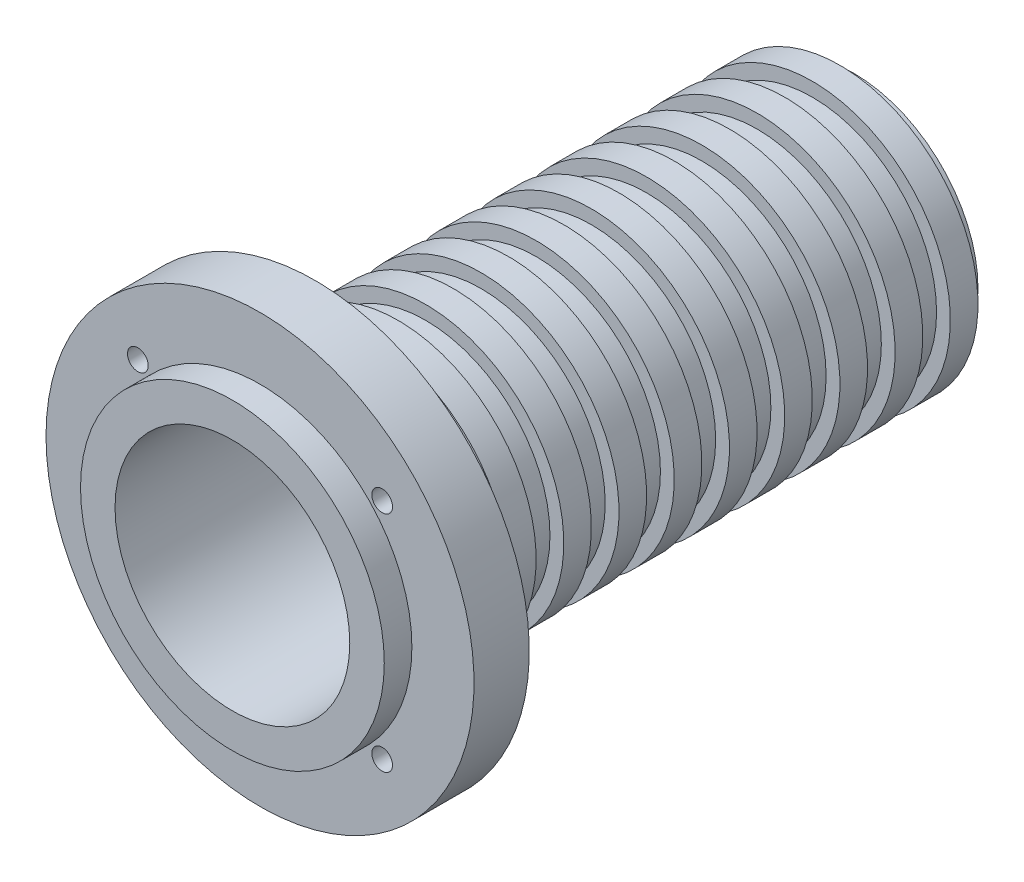
ISO-10303-21;
HEADER;
FILE_DESCRIPTION(('STEP AP214'),'2;1');
FILE_NAME('part.step','',(''),(''),'','','');
FILE_SCHEMA(('AUTOMOTIVE_DESIGN { 1 0 10303 214 1 1 1 1 }'));
ENDSEC;
DATA;
#1=APPLICATION_CONTEXT('core data for automotive mechanical design processes');
#2=APPLICATION_PROTOCOL_DEFINITION('international standard','automotive_design',2000,#1);
#3=PRODUCT_CONTEXT('',#1,'mechanical');
#4=PRODUCT('Part','Part','',(#3));
#5=PRODUCT_RELATED_PRODUCT_CATEGORY('part','',(#4));
#6=PRODUCT_DEFINITION_FORMATION('','',#4);
#7=PRODUCT_DEFINITION_CONTEXT('part definition',#1,'design');
#8=PRODUCT_DEFINITION('design','',#6,#7);
#9=PRODUCT_DEFINITION_SHAPE('','',#8);
#10=(LENGTH_UNIT() NAMED_UNIT(*) SI_UNIT(.MILLI.,.METRE.));
#11=(NAMED_UNIT(*) PLANE_ANGLE_UNIT() SI_UNIT($,.RADIAN.));
#12=(NAMED_UNIT(*) SI_UNIT($,.STERADIAN.) SOLID_ANGLE_UNIT());
#13=UNCERTAINTY_MEASURE_WITH_UNIT(LENGTH_MEASURE(1.E-05),#10,'distance_accuracy_value','');
#14=(GEOMETRIC_REPRESENTATION_CONTEXT(3) GLOBAL_UNCERTAINTY_ASSIGNED_CONTEXT((#13)) GLOBAL_UNIT_ASSIGNED_CONTEXT((#10,
#11,#12)) REPRESENTATION_CONTEXT('',''));
#15=CARTESIAN_POINT('',(0.,0.,0.));
#16=DIRECTION('',(0.,0.,1.));
#17=DIRECTION('',(1.,0.,0.));
#18=AXIS2_PLACEMENT_3D('',#15,#16,#17);
#19=CARTESIAN_POINT('',(0.,0.,-86.));
#20=DIRECTION('',(0.,0.,1.));
#21=DIRECTION('',(1.,0.,0.));
#22=AXIS2_PLACEMENT_3D('',#19,#20,#21);
#23=CYLINDRICAL_SURFACE('',#22,18.);
#24=CARTESIAN_POINT('',(0.,0.,-76.));
#25=DIRECTION('',(0.,0.,-1.));
#26=DIRECTION('',(-1.,0.,0.));
#27=AXIS2_PLACEMENT_3D('',#24,#25,#26);
#28=CIRCLE('',#27,18.);
#29=CARTESIAN_POINT('',(-18.,0.,-76.));
#30=VERTEX_POINT('',#29);
#31=EDGE_CURVE('E194',#30,#30,#28,.F.);
#32=ORIENTED_EDGE('',*,*,#31,.F.);
#33=EDGE_LOOP('',(#32));
#34=FACE_BOUND('',#33,.T.);
#35=CARTESIAN_POINT('',(0.,0.,-80.));
#36=DIRECTION('',(0.,0.,-1.));
#37=DIRECTION('',(-1.,0.,0.));
#38=AXIS2_PLACEMENT_3D('',#35,#36,#37);
#39=CIRCLE('',#38,18.);
#40=CARTESIAN_POINT('',(-18.,0.,-80.));
#41=VERTEX_POINT('',#40);
#42=EDGE_CURVE('E10',#41,#41,#39,.T.);
#43=ORIENTED_EDGE('',*,*,#42,.F.);
#44=EDGE_LOOP('',(#43));
#45=FACE_BOUND('',#44,.T.);
#46=ADVANCED_FACE('F38',(#34,#45),#23,.T.);
#47=CARTESIAN_POINT('',(0.,0.,-68.));
#48=DIRECTION('',(0.,0.,-1.));
#49=DIRECTION('',(-1.,0.,0.));
#50=AXIS2_PLACEMENT_3D('',#47,#48,#49);
#51=CIRCLE('',#50,18.);
#52=CARTESIAN_POINT('',(-18.,0.,-68.));
#53=VERTEX_POINT('',#52);
#54=EDGE_CURVE('E185',#53,#53,#51,.F.);
#55=ORIENTED_EDGE('',*,*,#54,.F.);
#56=EDGE_LOOP('',(#55));
#57=FACE_BOUND('',#56,.T.);
#58=CARTESIAN_POINT('',(0.,0.,-72.));
#59=DIRECTION('',(0.,0.,-1.));
#60=DIRECTION('',(-1.,0.,0.));
#61=AXIS2_PLACEMENT_3D('',#58,#59,#60);
#62=CIRCLE('',#61,18.);
#63=CARTESIAN_POINT('',(-18.,0.,-72.));
#64=VERTEX_POINT('',#63);
#65=EDGE_CURVE('E45',#64,#64,#62,.T.);
#66=ORIENTED_EDGE('',*,*,#65,.F.);
#67=EDGE_LOOP('',(#66));
#68=FACE_BOUND('',#67,.T.);
#69=ADVANCED_FACE('F233',(#57,#68),#23,.T.);
#70=CARTESIAN_POINT('',(0.,0.,-60.));
#71=DIRECTION('',(0.,0.,-1.));
#72=DIRECTION('',(-1.,0.,0.));
#73=AXIS2_PLACEMENT_3D('',#70,#71,#72);
#74=CIRCLE('',#73,18.);
#75=CARTESIAN_POINT('',(-18.,0.,-60.));
#76=VERTEX_POINT('',#75);
#77=EDGE_CURVE('E176',#76,#76,#74,.F.);
#78=ORIENTED_EDGE('',*,*,#77,.F.);
#79=EDGE_LOOP('',(#78));
#80=FACE_BOUND('',#79,.T.);
#81=CARTESIAN_POINT('',(0.,0.,-64.));
#82=DIRECTION('',(0.,0.,-1.));
#83=DIRECTION('',(-1.,0.,0.));
#84=AXIS2_PLACEMENT_3D('',#81,#82,#83);
#85=CIRCLE('',#84,18.);
#86=CARTESIAN_POINT('',(-18.,0.,-64.));
#87=VERTEX_POINT('',#86);
#88=EDGE_CURVE('E49',#87,#87,#85,.T.);
#89=ORIENTED_EDGE('',*,*,#88,.F.);
#90=EDGE_LOOP('',(#89));
#91=FACE_BOUND('',#90,.T.);
#92=ADVANCED_FACE('F238',(#80,#91),#23,.T.);
#93=CARTESIAN_POINT('',(0.,0.,-52.));
#94=DIRECTION('',(0.,0.,-1.));
#95=DIRECTION('',(-1.,0.,0.));
#96=AXIS2_PLACEMENT_3D('',#93,#94,#95);
#97=CIRCLE('',#96,18.);
#98=CARTESIAN_POINT('',(-18.,0.,-52.));
#99=VERTEX_POINT('',#98);
#100=EDGE_CURVE('E167',#99,#99,#97,.F.);
#101=ORIENTED_EDGE('',*,*,#100,.F.);
#102=EDGE_LOOP('',(#101));
#103=FACE_BOUND('',#102,.T.);
#104=CARTESIAN_POINT('',(0.,0.,-56.));
#105=DIRECTION('',(0.,0.,-1.));
#106=DIRECTION('',(-1.,0.,0.));
#107=AXIS2_PLACEMENT_3D('',#104,#105,#106);
#108=CIRCLE('',#107,18.);
#109=CARTESIAN_POINT('',(-18.,0.,-56.));
#110=VERTEX_POINT('',#109);
#111=EDGE_CURVE('E53',#110,#110,#108,.T.);
#112=ORIENTED_EDGE('',*,*,#111,.F.);
#113=EDGE_LOOP('',(#112));
#114=FACE_BOUND('',#113,.T.);
#115=ADVANCED_FACE('F381',(#103,#114),#23,.T.);
#116=CARTESIAN_POINT('',(0.,0.,-44.));
#117=DIRECTION('',(0.,0.,-1.));
#118=DIRECTION('',(-1.,0.,0.));
#119=AXIS2_PLACEMENT_3D('',#116,#117,#118);
#120=CIRCLE('',#119,18.);
#121=CARTESIAN_POINT('',(-18.,0.,-44.));
#122=VERTEX_POINT('',#121);
#123=EDGE_CURVE('E158',#122,#122,#120,.F.);
#124=ORIENTED_EDGE('',*,*,#123,.F.);
#125=EDGE_LOOP('',(#124));
#126=FACE_BOUND('',#125,.T.);
#127=CARTESIAN_POINT('',(0.,0.,-48.));
#128=DIRECTION('',(0.,0.,-1.));
#129=DIRECTION('',(-1.,0.,0.));
#130=AXIS2_PLACEMENT_3D('',#127,#128,#129);
#131=CIRCLE('',#130,18.);
#132=CARTESIAN_POINT('',(-18.,0.,-48.));
#133=VERTEX_POINT('',#132);
#134=EDGE_CURVE('E58',#133,#133,#131,.T.);
#135=ORIENTED_EDGE('',*,*,#134,.F.);
#136=EDGE_LOOP('',(#135));
#137=FACE_BOUND('',#136,.T.);
#138=ADVANCED_FACE('F390',(#126,#137),#23,.T.);
#139=CARTESIAN_POINT('',(0.,0.,-36.));
#140=DIRECTION('',(0.,0.,-1.));
#141=DIRECTION('',(-1.,0.,0.));
#142=AXIS2_PLACEMENT_3D('',#139,#140,#141);
#143=CIRCLE('',#142,18.);
#144=CARTESIAN_POINT('',(-18.,0.,-36.));
#145=VERTEX_POINT('',#144);
#146=EDGE_CURVE('E149',#145,#145,#143,.F.);
#147=ORIENTED_EDGE('',*,*,#146,.F.);
#148=EDGE_LOOP('',(#147));
#149=FACE_BOUND('',#148,.T.);
#150=CARTESIAN_POINT('',(0.,0.,-40.));
#151=DIRECTION('',(0.,0.,-1.));
#152=DIRECTION('',(-1.,0.,0.));
#153=AXIS2_PLACEMENT_3D('',#150,#151,#152);
#154=CIRCLE('',#153,18.);
#155=CARTESIAN_POINT('',(-18.,0.,-40.));
#156=VERTEX_POINT('',#155);
#157=EDGE_CURVE('E61',#156,#156,#154,.T.);
#158=ORIENTED_EDGE('',*,*,#157,.F.);
#159=EDGE_LOOP('',(#158));
#160=FACE_BOUND('',#159,.T.);
#161=ADVANCED_FACE('F399',(#149,#160),#23,.T.);
#162=CARTESIAN_POINT('',(0.,0.,-28.));
#163=DIRECTION('',(0.,0.,-1.));
#164=DIRECTION('',(-1.,0.,0.));
#165=AXIS2_PLACEMENT_3D('',#162,#163,#164);
#166=CIRCLE('',#165,18.);
#167=CARTESIAN_POINT('',(-18.,0.,-28.));
#168=VERTEX_POINT('',#167);
#169=EDGE_CURVE('E140',#168,#168,#166,.F.);
#170=ORIENTED_EDGE('',*,*,#169,.F.);
#171=EDGE_LOOP('',(#170));
#172=FACE_BOUND('',#171,.T.);
#173=CARTESIAN_POINT('',(0.,0.,-32.));
#174=DIRECTION('',(0.,0.,-1.));
#175=DIRECTION('',(-1.,0.,0.));
#176=AXIS2_PLACEMENT_3D('',#173,#174,#175);
#177=CIRCLE('',#176,18.);
#178=CARTESIAN_POINT('',(-18.,0.,-32.));
#179=VERTEX_POINT('',#178);
#180=EDGE_CURVE('E64',#179,#179,#177,.T.);
#181=ORIENTED_EDGE('',*,*,#180,.F.);
#182=EDGE_LOOP('',(#181));
#183=FACE_BOUND('',#182,.T.);
#184=ADVANCED_FACE('F294',(#172,#183),#23,.T.);
#185=CARTESIAN_POINT('',(0.,0.,-20.));
#186=DIRECTION('',(0.,0.,-1.));
#187=DIRECTION('',(-1.,0.,0.));
#188=AXIS2_PLACEMENT_3D('',#185,#186,#187);
#189=CIRCLE('',#188,18.);
#190=CARTESIAN_POINT('',(-18.,0.,-20.));
#191=VERTEX_POINT('',#190);
#192=EDGE_CURVE('E131',#191,#191,#189,.F.);
#193=ORIENTED_EDGE('',*,*,#192,.F.);
#194=EDGE_LOOP('',(#193));
#195=FACE_BOUND('',#194,.T.);
#196=CARTESIAN_POINT('',(0.,0.,-24.));
#197=DIRECTION('',(0.,0.,-1.));
#198=DIRECTION('',(-1.,0.,0.));
#199=AXIS2_PLACEMENT_3D('',#196,#197,#198);
#200=CIRCLE('',#199,18.);
#201=CARTESIAN_POINT('',(-18.,0.,-24.));
#202=VERTEX_POINT('',#201);
#203=EDGE_CURVE('E67',#202,#202,#200,.T.);
#204=ORIENTED_EDGE('',*,*,#203,.F.);
#205=EDGE_LOOP('',(#204));
#206=FACE_BOUND('',#205,.T.);
#207=ADVANCED_FACE('F289',(#195,#206),#23,.T.);
#208=CARTESIAN_POINT('',(0.,0.,-12.));
#209=DIRECTION('',(0.,0.,-1.));
#210=DIRECTION('',(-1.,0.,0.));
#211=AXIS2_PLACEMENT_3D('',#208,#209,#210);
#212=CIRCLE('',#211,18.);
#213=CARTESIAN_POINT('',(-18.,0.,-12.));
#214=VERTEX_POINT('',#213);
#215=EDGE_CURVE('E122',#214,#214,#212,.F.);
#216=ORIENTED_EDGE('',*,*,#215,.F.);
#217=EDGE_LOOP('',(#216));
#218=FACE_BOUND('',#217,.T.);
#219=CARTESIAN_POINT('',(0.,0.,-16.));
#220=DIRECTION('',(0.,0.,-1.));
#221=DIRECTION('',(-1.,0.,0.));
#222=AXIS2_PLACEMENT_3D('',#219,#220,#221);
#223=CIRCLE('',#222,18.);
#224=CARTESIAN_POINT('',(-18.,0.,-16.));
#225=VERTEX_POINT('',#224);
#226=EDGE_CURVE('E70',#225,#225,#223,.T.);
#227=ORIENTED_EDGE('',*,*,#226,.F.);
#228=EDGE_LOOP('',(#227));
#229=FACE_BOUND('',#228,.T.);
#230=ADVANCED_FACE('F218',(#218,#229),#23,.T.);
#231=CARTESIAN_POINT('',(0.,0.,4.));
#232=DIRECTION('',(0.,0.,-1.));
#233=DIRECTION('',(-1.,0.,0.));
#234=AXIS2_PLACEMENT_3D('',#231,#232,#233);
#235=CYLINDRICAL_SURFACE('',#234,22.);
#236=CARTESIAN_POINT('',(0.,0.,4.));
#237=DIRECTION('',(0.,0.,1.));
#238=DIRECTION('',(1.,0.,0.));
#239=AXIS2_PLACEMENT_3D('',#236,#237,#238);
#240=CIRCLE('',#239,22.);
#241=CARTESIAN_POINT('',(22.,0.,4.));
#242=VERTEX_POINT('',#241);
#243=EDGE_CURVE('E73',#242,#242,#240,.T.);
#244=ORIENTED_EDGE('',*,*,#243,.F.);
#245=EDGE_LOOP('',(#244));
#246=FACE_BOUND('',#245,.T.);
#247=CARTESIAN_POINT('',(0.,0.,0.));
#248=DIRECTION('',(0.,0.,1.));
#249=DIRECTION('',(1.,0.,0.));
#250=AXIS2_PLACEMENT_3D('',#247,#248,#249);
#251=CIRCLE('',#250,22.);
#252=CARTESIAN_POINT('',(22.,0.,0.));
#253=VERTEX_POINT('',#252);
#254=EDGE_CURVE('E88',#253,#253,#251,.T.);
#255=ORIENTED_EDGE('',*,*,#254,.T.);
#256=EDGE_LOOP('',(#255));
#257=FACE_BOUND('',#256,.T.);
#258=ADVANCED_FACE('F40',(#246,#257),#235,.T.);
#259=CARTESIAN_POINT('',(0.,0.,4.));
#260=DIRECTION('',(0.,0.,1.));
#261=DIRECTION('',(1.,0.,0.));
#262=AXIS2_PLACEMENT_3D('',#259,#260,#261);
#263=PLANE('',#262);
#264=CARTESIAN_POINT('',(0.,0.,4.));
#265=DIRECTION('',(0.,0.,-1.));
#266=DIRECTION('',(-1.,0.,0.));
#267=AXIS2_PLACEMENT_3D('',#264,#265,#266);
#268=CIRCLE('',#267,17.);
#269=CARTESIAN_POINT('',(-17.,0.,4.));
#270=VERTEX_POINT('',#269);
#271=EDGE_CURVE('E112',#270,#270,#268,.T.);
#272=ORIENTED_EDGE('',*,*,#271,.T.);
#273=EDGE_LOOP('',(#272));
#274=FACE_BOUND('',#273,.T.);
#275=ORIENTED_EDGE('',*,*,#243,.T.);
#276=EDGE_LOOP('',(#275));
#277=FACE_BOUND('',#276,.T.);
#278=ADVANCED_FACE('F268',(#274,#277),#263,.T.);
#279=CARTESIAN_POINT('',(0.,0.,-8.));
#280=DIRECTION('',(0.,0.,1.));
#281=DIRECTION('',(1.,0.,0.));
#282=AXIS2_PLACEMENT_3D('',#279,#280,#281);
#283=CYLINDRICAL_SURFACE('',#282,31.);
#284=CARTESIAN_POINT('',(0.,0.,-8.));
#285=DIRECTION('',(0.,0.,-1.));
#286=DIRECTION('',(-1.,0.,0.));
#287=AXIS2_PLACEMENT_3D('',#284,#285,#286);
#288=CIRCLE('',#287,31.);
#289=CARTESIAN_POINT('',(-31.,0.,-8.));
#290=VERTEX_POINT('',#289);
#291=EDGE_CURVE('E91',#290,#290,#288,.T.);
#292=ORIENTED_EDGE('',*,*,#291,.F.);
#293=EDGE_LOOP('',(#292));
#294=FACE_BOUND('',#293,.T.);
#295=CARTESIAN_POINT('',(0.,0.,0.));
#296=DIRECTION('',(0.,0.,-1.));
#297=DIRECTION('',(-1.,0.,0.));
#298=AXIS2_PLACEMENT_3D('',#295,#296,#297);
#299=CIRCLE('',#298,31.);
#300=CARTESIAN_POINT('',(-31.,0.,0.));
#301=VERTEX_POINT('',#300);
#302=EDGE_CURVE('E77',#301,#301,#299,.T.);
#303=ORIENTED_EDGE('',*,*,#302,.T.);
#304=EDGE_LOOP('',(#303));
#305=FACE_BOUND('',#304,.T.);
#306=ADVANCED_FACE('F262',(#294,#305),#283,.T.);
#307=CARTESIAN_POINT('',(0.,0.,-8.));
#308=DIRECTION('',(0.,0.,-1.));
#309=DIRECTION('',(-1.,0.,0.));
#310=AXIS2_PLACEMENT_3D('',#307,#308,#309);
#311=PLANE('',#310);
#312=CARTESIAN_POINT('',(0.,0.,-8.));
#313=DIRECTION('',(0.,0.,-1.));
#314=DIRECTION('',(-1.,0.,0.));
#315=AXIS2_PLACEMENT_3D('',#312,#313,#314);
#316=CIRCLE('',#315,20.);
#317=CARTESIAN_POINT('',(-20.,0.,-8.));
#318=VERTEX_POINT('',#317);
#319=EDGE_CURVE('E119',#318,#318,#316,.T.);
#320=ORIENTED_EDGE('',*,*,#319,.F.);
#321=EDGE_LOOP('',(#320));
#322=FACE_BOUND('',#321,.T.);
#323=CARTESIAN_POINT('',(-17.695427461586,16.2133231310471,-8.));
#324=DIRECTION('',(0.,0.,-1.));
#325=DIRECTION('',(-1.,0.,0.));
#326=AXIS2_PLACEMENT_3D('',#323,#324,#325);
#327=CIRCLE('',#326,1.5);
#328=CARTESIAN_POINT('',(-19.1954274615861,16.2133231310471,-8.));
#329=VERTEX_POINT('',#328);
#330=EDGE_CURVE('E101',#329,#329,#327,.T.);
#331=ORIENTED_EDGE('',*,*,#330,.F.);
#332=EDGE_LOOP('',(#331));
#333=FACE_BOUND('',#332,.T.);
#334=CARTESIAN_POINT('',(-17.6954274615861,-16.2133231310471,-8.));
#335=DIRECTION('',(0.,0.,-1.));
#336=DIRECTION('',(-1.,0.,0.));
#337=AXIS2_PLACEMENT_3D('',#334,#335,#336);
#338=CIRCLE('',#337,1.5);
#339=CARTESIAN_POINT('',(-19.1954274615861,-16.2133231310471,-8.));
#340=VERTEX_POINT('',#339);
#341=EDGE_CURVE('E104',#340,#340,#338,.T.);
#342=ORIENTED_EDGE('',*,*,#341,.F.);
#343=EDGE_LOOP('',(#342));
#344=FACE_BOUND('',#343,.T.);
#345=CARTESIAN_POINT('',(17.6954274615861,-16.2133231310471,-8.));
#346=DIRECTION('',(0.,0.,-1.));
#347=DIRECTION('',(-1.,0.,0.));
#348=AXIS2_PLACEMENT_3D('',#345,#346,#347);
#349=CIRCLE('',#348,1.5);
#350=CARTESIAN_POINT('',(16.1954274615861,-16.2133231310471,-8.));
#351=VERTEX_POINT('',#350);
#352=EDGE_CURVE('E100',#351,#351,#349,.T.);
#353=ORIENTED_EDGE('',*,*,#352,.F.);
#354=EDGE_LOOP('',(#353));
#355=FACE_BOUND('',#354,.T.);
#356=CARTESIAN_POINT('',(17.6954274615861,16.2133231310471,-8.));
#357=DIRECTION('',(0.,0.,-1.));
#358=DIRECTION('',(-1.,0.,0.));
#359=AXIS2_PLACEMENT_3D('',#356,#357,#358);
#360=CIRCLE('',#359,1.5);
#361=CARTESIAN_POINT('',(16.1954274615861,16.2133231310471,-8.));
#362=VERTEX_POINT('',#361);
#363=EDGE_CURVE('E87',#362,#362,#360,.T.);
#364=ORIENTED_EDGE('',*,*,#363,.F.);
#365=EDGE_LOOP('',(#364));
#366=FACE_BOUND('',#365,.T.);
#367=ORIENTED_EDGE('',*,*,#291,.T.);
#368=EDGE_LOOP('',(#367));
#369=FACE_BOUND('',#368,.T.);
#370=ADVANCED_FACE('F259',(#322,#333,#344,#355,#366,#369),#311,.T.);
#371=CARTESIAN_POINT('',(0.,0.,0.));
#372=DIRECTION('',(0.,0.,-1.));
#373=DIRECTION('',(-1.,0.,0.));
#374=AXIS2_PLACEMENT_3D('',#371,#372,#373);
#375=PLANE('',#374);
#376=CARTESIAN_POINT('',(-17.695427461586,16.2133231310471,0.));
#377=DIRECTION('',(0.,0.,-1.));
#378=DIRECTION('',(-1.,0.,0.));
#379=AXIS2_PLACEMENT_3D('',#376,#377,#378);
#380=CIRCLE('',#379,1.5);
#381=CARTESIAN_POINT('',(-19.1954274615861,16.2133231310471,0.));
#382=VERTEX_POINT('',#381);
#383=EDGE_CURVE('E74',#382,#382,#380,.T.);
#384=ORIENTED_EDGE('',*,*,#383,.T.);
#385=EDGE_LOOP('',(#384));
#386=FACE_BOUND('',#385,.T.);
#387=CARTESIAN_POINT('',(-17.6954274615861,-16.2133231310471,0.));
#388=DIRECTION('',(0.,0.,-1.));
#389=DIRECTION('',(-1.,0.,0.));
#390=AXIS2_PLACEMENT_3D('',#387,#388,#389);
#391=CIRCLE('',#390,1.5);
#392=CARTESIAN_POINT('',(-19.1954274615861,-16.2133231310471,0.));
#393=VERTEX_POINT('',#392);
#394=EDGE_CURVE('E78',#393,#393,#391,.T.);
#395=ORIENTED_EDGE('',*,*,#394,.T.);
#396=EDGE_LOOP('',(#395));
#397=FACE_BOUND('',#396,.T.);
#398=CARTESIAN_POINT('',(17.6954274615861,-16.2133231310471,0.));
#399=DIRECTION('',(0.,0.,-1.));
#400=DIRECTION('',(-1.,0.,0.));
#401=AXIS2_PLACEMENT_3D('',#398,#399,#400);
#402=CIRCLE('',#401,1.5);
#403=CARTESIAN_POINT('',(16.1954274615861,-16.2133231310471,0.));
#404=VERTEX_POINT('',#403);
#405=EDGE_CURVE('E81',#404,#404,#402,.T.);
#406=ORIENTED_EDGE('',*,*,#405,.T.);
#407=EDGE_LOOP('',(#406));
#408=FACE_BOUND('',#407,.T.);
#409=CARTESIAN_POINT('',(17.6954274615861,16.2133231310471,0.));
#410=DIRECTION('',(0.,0.,-1.));
#411=DIRECTION('',(-1.,0.,0.));
#412=AXIS2_PLACEMENT_3D('',#409,#410,#411);
#413=CIRCLE('',#412,1.5);
#414=CARTESIAN_POINT('',(16.1954274615861,16.2133231310471,0.));
#415=VERTEX_POINT('',#414);
#416=EDGE_CURVE('E84',#415,#415,#413,.T.);
#417=ORIENTED_EDGE('',*,*,#416,.T.);
#418=EDGE_LOOP('',(#417));
#419=FACE_BOUND('',#418,.T.);
#420=ORIENTED_EDGE('',*,*,#254,.F.);
#421=EDGE_LOOP('',(#420));
#422=FACE_BOUND('',#421,.T.);
#423=ORIENTED_EDGE('',*,*,#302,.F.);
#424=EDGE_LOOP('',(#423));
#425=FACE_BOUND('',#424,.T.);
#426=ADVANCED_FACE('F257',(#386,#397,#408,#419,#422,#425),#375,.F.);
#427=CARTESIAN_POINT('',(17.6954274615861,16.2133231310471,4.));
#428=DIRECTION('',(0.,0.,-1.));
#429=DIRECTION('',(-1.,0.,0.));
#430=AXIS2_PLACEMENT_3D('',#427,#428,#429);
#431=CYLINDRICAL_SURFACE('',#430,1.5);
#432=ORIENTED_EDGE('',*,*,#363,.T.);
#433=EDGE_LOOP('',(#432));
#434=FACE_BOUND('',#433,.T.);
#435=ORIENTED_EDGE('',*,*,#416,.F.);
#436=EDGE_LOOP('',(#435));
#437=FACE_BOUND('',#436,.T.);
#438=ADVANCED_FACE('F247',(#434,#437),#431,.F.);
#439=CARTESIAN_POINT('',(17.6954274615861,-16.2133231310471,4.));
#440=DIRECTION('',(0.,0.,-1.));
#441=DIRECTION('',(-1.,0.,0.));
#442=AXIS2_PLACEMENT_3D('',#439,#440,#441);
#443=CYLINDRICAL_SURFACE('',#442,1.5);
#444=ORIENTED_EDGE('',*,*,#352,.T.);
#445=EDGE_LOOP('',(#444));
#446=FACE_BOUND('',#445,.T.);
#447=ORIENTED_EDGE('',*,*,#405,.F.);
#448=EDGE_LOOP('',(#447));
#449=FACE_BOUND('',#448,.T.);
#450=ADVANCED_FACE('F243',(#446,#449),#443,.F.);
#451=CARTESIAN_POINT('',(-17.6954274615861,-16.2133231310471,4.));
#452=DIRECTION('',(0.,0.,-1.));
#453=DIRECTION('',(-1.,0.,0.));
#454=AXIS2_PLACEMENT_3D('',#451,#452,#453);
#455=CYLINDRICAL_SURFACE('',#454,1.5);
#456=ORIENTED_EDGE('',*,*,#341,.T.);
#457=EDGE_LOOP('',(#456));
#458=FACE_BOUND('',#457,.T.);
#459=ORIENTED_EDGE('',*,*,#394,.F.);
#460=EDGE_LOOP('',(#459));
#461=FACE_BOUND('',#460,.T.);
#462=ADVANCED_FACE('F246',(#458,#461),#455,.F.);
#463=CARTESIAN_POINT('',(-17.695427461586,16.2133231310471,4.));
#464=DIRECTION('',(0.,0.,-1.));
#465=DIRECTION('',(-1.,0.,0.));
#466=AXIS2_PLACEMENT_3D('',#463,#464,#465);
#467=CYLINDRICAL_SURFACE('',#466,1.5);
#468=ORIENTED_EDGE('',*,*,#330,.T.);
#469=EDGE_LOOP('',(#468));
#470=FACE_BOUND('',#469,.T.);
#471=ORIENTED_EDGE('',*,*,#383,.F.);
#472=EDGE_LOOP('',(#471));
#473=FACE_BOUND('',#472,.T.);
#474=ADVANCED_FACE('F216',(#470,#473),#467,.F.);
#475=CARTESIAN_POINT('',(0.,0.,-84.));
#476=DIRECTION('',(0.,0.,-1.));
#477=DIRECTION('',(-1.,0.,0.));
#478=AXIS2_PLACEMENT_3D('',#475,#476,#477);
#479=CIRCLE('',#478,18.);
#480=CARTESIAN_POINT('',(-18.,0.,-84.));
#481=VERTEX_POINT('',#480);
#482=EDGE_CURVE('E203',#481,#481,#479,.F.);
#483=ORIENTED_EDGE('',*,*,#482,.F.);
#484=EDGE_LOOP('',(#483));
#485=FACE_BOUND('',#484,.T.);
#486=CARTESIAN_POINT('',(0.,0.,-86.));
#487=DIRECTION('',(0.,0.,-1.));
#488=DIRECTION('',(-1.,0.,0.));
#489=AXIS2_PLACEMENT_3D('',#486,#487,#488);
#490=CIRCLE('',#489,18.);
#491=CARTESIAN_POINT('',(-18.,0.,-86.));
#492=VERTEX_POINT('',#491);
#493=EDGE_CURVE('E105',#492,#492,#490,.T.);
#494=ORIENTED_EDGE('',*,*,#493,.F.);
#495=EDGE_LOOP('',(#494));
#496=FACE_BOUND('',#495,.T.);
#497=ADVANCED_FACE('F212',(#485,#496),#23,.T.);
#498=CARTESIAN_POINT('',(0.,0.,-86.));
#499=DIRECTION('',(0.,0.,-1.));
#500=DIRECTION('',(-1.,0.,0.));
#501=AXIS2_PLACEMENT_3D('',#498,#499,#500);
#502=PLANE('',#501);
#503=CARTESIAN_POINT('',(0.,0.,-86.));
#504=DIRECTION('',(0.,0.,-1.));
#505=DIRECTION('',(-1.,0.,0.));
#506=AXIS2_PLACEMENT_3D('',#503,#504,#505);
#507=CIRCLE('',#506,17.);
#508=CARTESIAN_POINT('',(-17.,0.,-86.));
#509=VERTEX_POINT('',#508);
#510=EDGE_CURVE('E113',#509,#509,#507,.T.);
#511=ORIENTED_EDGE('',*,*,#510,.F.);
#512=EDGE_LOOP('',(#511));
#513=FACE_BOUND('',#512,.T.);
#514=ORIENTED_EDGE('',*,*,#493,.T.);
#515=EDGE_LOOP('',(#514));
#516=FACE_BOUND('',#515,.T.);
#517=ADVANCED_FACE('F215',(#513,#516),#502,.T.);
#518=CARTESIAN_POINT('',(0.,0.,4.));
#519=DIRECTION('',(0.,0.,-1.));
#520=DIRECTION('',(-1.,0.,0.));
#521=AXIS2_PLACEMENT_3D('',#518,#519,#520);
#522=CYLINDRICAL_SURFACE('',#521,17.);
#523=CARTESIAN_POINT('',(-17.,0.,4.));
#524=CARTESIAN_POINT('',(-17.,0.,3.06250000000001));
#525=CARTESIAN_POINT('',(-17.,0.,2.125));
#526=CARTESIAN_POINT('',(-17.,0.,0.250000000000004));
#527=CARTESIAN_POINT('',(-17.,0.,-0.687499999999996));
#528=CARTESIAN_POINT('',(-17.,0.,-2.5625));
#529=CARTESIAN_POINT('',(-17.,0.,-3.5));
#530=CARTESIAN_POINT('',(-17.,0.,-5.37499999999999));
#531=CARTESIAN_POINT('',(-17.,0.,-6.3125));
#532=CARTESIAN_POINT('',(-17.,0.,-8.18749999999999));
#533=CARTESIAN_POINT('',(-17.,0.,-9.12499999999999));
#534=CARTESIAN_POINT('',(-17.,0.,-11.));
#535=CARTESIAN_POINT('',(-17.,0.,-11.9375));
#536=CARTESIAN_POINT('',(-17.,0.,-13.8125));
#537=CARTESIAN_POINT('',(-17.,0.,-14.75));
#538=CARTESIAN_POINT('',(-17.,0.,-16.625));
#539=CARTESIAN_POINT('',(-17.,0.,-17.5625));
#540=CARTESIAN_POINT('',(-17.,0.,-19.4375));
#541=CARTESIAN_POINT('',(-17.,0.,-20.375));
#542=CARTESIAN_POINT('',(-17.,0.,-22.25));
#543=CARTESIAN_POINT('',(-17.,0.,-23.1875));
#544=CARTESIAN_POINT('',(-17.,0.,-25.0625));
#545=CARTESIAN_POINT('',(-17.,0.,-26.));
#546=CARTESIAN_POINT('',(-17.,0.,-27.875));
#547=CARTESIAN_POINT('',(-17.,0.,-28.8125));
#548=CARTESIAN_POINT('',(-17.,0.,-30.6875));
#549=CARTESIAN_POINT('',(-17.,0.,-31.625));
#550=CARTESIAN_POINT('',(-17.,0.,-33.5));
#551=CARTESIAN_POINT('',(-17.,0.,-34.4375));
#552=CARTESIAN_POINT('',(-17.,0.,-36.3125));
#553=CARTESIAN_POINT('',(-17.,0.,-37.25));
#554=CARTESIAN_POINT('',(-17.,0.,-39.125));
#555=CARTESIAN_POINT('',(-17.,0.,-40.0625));
#556=CARTESIAN_POINT('',(-17.,0.,-41.9375));
#557=CARTESIAN_POINT('',(-17.,0.,-42.875));
#558=CARTESIAN_POINT('',(-17.,0.,-44.75));
#559=CARTESIAN_POINT('',(-17.,0.,-45.6875));
#560=CARTESIAN_POINT('',(-17.,0.,-47.5625));
#561=CARTESIAN_POINT('',(-17.,0.,-48.5));
#562=CARTESIAN_POINT('',(-17.,0.,-50.375));
#563=CARTESIAN_POINT('',(-17.,0.,-51.3125));
#564=CARTESIAN_POINT('',(-17.,0.,-53.1875));
#565=CARTESIAN_POINT('',(-17.,0.,-54.125));
#566=CARTESIAN_POINT('',(-17.,0.,-56.));
#567=CARTESIAN_POINT('',(-17.,0.,-56.9375));
#568=CARTESIAN_POINT('',(-17.,0.,-58.8125));
#569=CARTESIAN_POINT('',(-17.,0.,-59.75));
#570=CARTESIAN_POINT('',(-17.,0.,-61.625));
#571=CARTESIAN_POINT('',(-17.,0.,-62.5625));
#572=CARTESIAN_POINT('',(-17.,0.,-64.4375));
#573=CARTESIAN_POINT('',(-17.,0.,-65.375));
#574=CARTESIAN_POINT('',(-17.,0.,-67.25));
#575=CARTESIAN_POINT('',(-17.,0.,-68.1875));
#576=CARTESIAN_POINT('',(-17.,0.,-70.0625));
#577=CARTESIAN_POINT('',(-17.,0.,-71.));
#578=CARTESIAN_POINT('',(-17.,0.,-72.875));
#579=CARTESIAN_POINT('',(-17.,0.,-73.8125));
#580=CARTESIAN_POINT('',(-17.,0.,-75.6875));
#581=CARTESIAN_POINT('',(-17.,0.,-76.625));
#582=CARTESIAN_POINT('',(-17.,0.,-78.5));
#583=CARTESIAN_POINT('',(-17.,0.,-79.4375));
#584=CARTESIAN_POINT('',(-17.,0.,-81.3125));
#585=CARTESIAN_POINT('',(-17.,0.,-82.25));
#586=CARTESIAN_POINT('',(-17.,0.,-84.125));
#587=CARTESIAN_POINT('',(-17.,0.,-85.0625));
#588=CARTESIAN_POINT('',(-17.,0.,-86.));
#589=B_SPLINE_CURVE_WITH_KNOTS('',3,(#523,#524,#525,#526,#527,#528,#529,#530,#531,#532,#533,
#534,#535,#536,#537,#538,#539,#540,#541,#542,#543,#544,#545,#546,#547,#548,#549,#550,#551,#552,
#553,#554,#555,#556,#557,#558,#559,#560,#561,#562,#563,#564,#565,#566,#567,#568,#569,#570,#571,
#572,#573,#574,#575,#576,#577,#578,#579,#580,#581,#582,#583,#584,#585,#586,#587,#588),
.UNSPECIFIED.,.F.,.F.,(4,2,2,2,2,2,2,2,2,2,2,2,2,2,2,2,2,2,2,2,2,2,2,2,2,2,2,2,2,2,2,2,4),(0.,
2.8125,5.625,8.4375,11.25,14.0625,16.875,19.6875,22.5,25.3125,28.125,30.9375,33.75,36.5625,
39.375,42.1875,45.,47.8125,50.625,53.4375,56.25,59.0625,61.875,64.6875,67.5,70.3125,73.125,
75.9375,78.75,81.5625,84.375,87.1875,90.),.UNSPECIFIED.);
#590=EDGE_CURVE('BSEAM222',#270,#509,#589,.T.);
#591=ORIENTED_EDGE('',*,*,#271,.F.);
#592=ORIENTED_EDGE('',*,*,#510,.T.);
#593=ORIENTED_EDGE('',*,*,#590,.T.);
#594=ORIENTED_EDGE('',*,*,#590,.F.);
#595=EDGE_LOOP('',(#591,#593,#592,#594));
#596=FACE_BOUND('',#595,.T.);
#597=ADVANCED_FACE('F222',(#596),#522,.F.);
#598=CARTESIAN_POINT('',(0.,0.,-12.));
#599=DIRECTION('',(0.,0.,1.));
#600=DIRECTION('',(1.,0.,0.));
#601=AXIS2_PLACEMENT_3D('',#598,#599,#600);
#602=CYLINDRICAL_SURFACE('',#601,20.);
#603=CARTESIAN_POINT('',(0.,0.,-12.));
#604=DIRECTION('',(0.,0.,-1.));
#605=DIRECTION('',(-1.,0.,0.));
#606=AXIS2_PLACEMENT_3D('',#603,#604,#605);
#607=CIRCLE('',#606,20.);
#608=CARTESIAN_POINT('',(-20.,0.,-12.));
#609=VERTEX_POINT('',#608);
#610=EDGE_CURVE('E116',#609,#609,#607,.T.);
#611=ORIENTED_EDGE('',*,*,#610,.F.);
#612=EDGE_LOOP('',(#611));
#613=FACE_BOUND('',#612,.T.);
#614=ORIENTED_EDGE('',*,*,#319,.T.);
#615=EDGE_LOOP('',(#614));
#616=FACE_BOUND('',#615,.T.);
#617=ADVANCED_FACE('F228',(#613,#616),#602,.T.);
#618=CARTESIAN_POINT('',(0.,0.,-12.));
#619=DIRECTION('',(0.,0.,-1.));
#620=DIRECTION('',(-1.,0.,0.));
#621=AXIS2_PLACEMENT_3D('',#618,#619,#620);
#622=PLANE('',#621);
#623=ORIENTED_EDGE('',*,*,#215,.T.);
#624=EDGE_LOOP('',(#623));
#625=FACE_BOUND('',#624,.T.);
#626=ORIENTED_EDGE('',*,*,#610,.T.);
#627=EDGE_LOOP('',(#626));
#628=FACE_BOUND('',#627,.T.);
#629=ADVANCED_FACE('F310',(#625,#628),#622,.T.);
#630=CARTESIAN_POINT('',(0.,0.,-20.));
#631=DIRECTION('',(0.,0.,1.));
#632=DIRECTION('',(1.,0.,0.));
#633=AXIS2_PLACEMENT_3D('',#630,#631,#632);
#634=CYLINDRICAL_SURFACE('',#633,20.);
#635=CARTESIAN_POINT('',(0.,0.,-20.));
#636=DIRECTION('',(0.,0.,-1.));
#637=DIRECTION('',(-1.,0.,0.));
#638=AXIS2_PLACEMENT_3D('',#635,#636,#637);
#639=CIRCLE('',#638,20.);
#640=CARTESIAN_POINT('',(-20.,0.,-20.));
#641=VERTEX_POINT('',#640);
#642=EDGE_CURVE('E123',#641,#641,#639,.T.);
#643=ORIENTED_EDGE('',*,*,#642,.F.);
#644=EDGE_LOOP('',(#643));
#645=FACE_BOUND('',#644,.T.);
#646=CARTESIAN_POINT('',(0.,0.,-16.));
#647=DIRECTION('',(0.,0.,-1.));
#648=DIRECTION('',(-1.,0.,0.));
#649=AXIS2_PLACEMENT_3D('',#646,#647,#648);
#650=CIRCLE('',#649,20.);
#651=CARTESIAN_POINT('',(-20.,0.,-16.));
#652=VERTEX_POINT('',#651);
#653=EDGE_CURVE('E128',#652,#652,#650,.T.);
#654=ORIENTED_EDGE('',*,*,#653,.T.);
#655=EDGE_LOOP('',(#654));
#656=FACE_BOUND('',#655,.T.);
#657=ADVANCED_FACE('F308',(#645,#656),#634,.T.);
#658=CARTESIAN_POINT('',(0.,0.,-20.));
#659=DIRECTION('',(0.,0.,-1.));
#660=DIRECTION('',(-1.,0.,0.));
#661=AXIS2_PLACEMENT_3D('',#658,#659,#660);
#662=PLANE('',#661);
#663=ORIENTED_EDGE('',*,*,#192,.T.);
#664=EDGE_LOOP('',(#663));
#665=FACE_BOUND('',#664,.T.);
#666=ORIENTED_EDGE('',*,*,#642,.T.);
#667=EDGE_LOOP('',(#666));
#668=FACE_BOUND('',#667,.T.);
#669=ADVANCED_FACE('F304',(#665,#668),#662,.T.);
#670=CARTESIAN_POINT('',(0.,0.,-16.));
#671=DIRECTION('',(0.,0.,-1.));
#672=DIRECTION('',(-1.,0.,0.));
#673=AXIS2_PLACEMENT_3D('',#670,#671,#672);
#674=PLANE('',#673);
#675=ORIENTED_EDGE('',*,*,#226,.T.);
#676=EDGE_LOOP('',(#675));
#677=FACE_BOUND('',#676,.T.);
#678=ORIENTED_EDGE('',*,*,#653,.F.);
#679=EDGE_LOOP('',(#678));
#680=FACE_BOUND('',#679,.T.);
#681=ADVANCED_FACE('F300',(#677,#680),#674,.F.);
#682=CARTESIAN_POINT('',(0.,0.,-28.));
#683=DIRECTION('',(0.,0.,1.));
#684=DIRECTION('',(1.,0.,0.));
#685=AXIS2_PLACEMENT_3D('',#682,#683,#684);
#686=CYLINDRICAL_SURFACE('',#685,20.);
#687=CARTESIAN_POINT('',(0.,0.,-28.));
#688=DIRECTION('',(0.,0.,-1.));
#689=DIRECTION('',(-1.,0.,0.));
#690=AXIS2_PLACEMENT_3D('',#687,#688,#689);
#691=CIRCLE('',#690,20.);
#692=CARTESIAN_POINT('',(-20.,0.,-28.));
#693=VERTEX_POINT('',#692);
#694=EDGE_CURVE('E132',#693,#693,#691,.T.);
#695=ORIENTED_EDGE('',*,*,#694,.F.);
#696=EDGE_LOOP('',(#695));
#697=FACE_BOUND('',#696,.T.);
#698=CARTESIAN_POINT('',(0.,0.,-24.));
#699=DIRECTION('',(0.,0.,-1.));
#700=DIRECTION('',(-1.,0.,0.));
#701=AXIS2_PLACEMENT_3D('',#698,#699,#700);
#702=CIRCLE('',#701,20.);
#703=CARTESIAN_POINT('',(-20.,0.,-24.));
#704=VERTEX_POINT('',#703);
#705=EDGE_CURVE('E137',#704,#704,#702,.T.);
#706=ORIENTED_EDGE('',*,*,#705,.T.);
#707=EDGE_LOOP('',(#706));
#708=FACE_BOUND('',#707,.T.);
#709=ADVANCED_FACE('F303',(#697,#708),#686,.T.);
#710=CARTESIAN_POINT('',(0.,0.,-28.));
#711=DIRECTION('',(0.,0.,-1.));
#712=DIRECTION('',(-1.,0.,0.));
#713=AXIS2_PLACEMENT_3D('',#710,#711,#712);
#714=PLANE('',#713);
#715=ORIENTED_EDGE('',*,*,#169,.T.);
#716=EDGE_LOOP('',(#715));
#717=FACE_BOUND('',#716,.T.);
#718=ORIENTED_EDGE('',*,*,#694,.T.);
#719=EDGE_LOOP('',(#718));
#720=FACE_BOUND('',#719,.T.);
#721=ADVANCED_FACE('F460',(#717,#720),#714,.T.);
#722=CARTESIAN_POINT('',(0.,0.,-24.));
#723=DIRECTION('',(0.,0.,-1.));
#724=DIRECTION('',(-1.,0.,0.));
#725=AXIS2_PLACEMENT_3D('',#722,#723,#724);
#726=PLANE('',#725);
#727=ORIENTED_EDGE('',*,*,#203,.T.);
#728=EDGE_LOOP('',(#727));
#729=FACE_BOUND('',#728,.T.);
#730=ORIENTED_EDGE('',*,*,#705,.F.);
#731=EDGE_LOOP('',(#730));
#732=FACE_BOUND('',#731,.T.);
#733=ADVANCED_FACE('F471',(#729,#732),#726,.F.);
#734=CARTESIAN_POINT('',(0.,0.,-36.));
#735=DIRECTION('',(0.,0.,1.));
#736=DIRECTION('',(1.,0.,0.));
#737=AXIS2_PLACEMENT_3D('',#734,#735,#736);
#738=CYLINDRICAL_SURFACE('',#737,20.);
#739=CARTESIAN_POINT('',(0.,0.,-36.));
#740=DIRECTION('',(0.,0.,-1.));
#741=DIRECTION('',(-1.,0.,0.));
#742=AXIS2_PLACEMENT_3D('',#739,#740,#741);
#743=CIRCLE('',#742,20.);
#744=CARTESIAN_POINT('',(-20.,0.,-36.));
#745=VERTEX_POINT('',#744);
#746=EDGE_CURVE('E141',#745,#745,#743,.T.);
#747=ORIENTED_EDGE('',*,*,#746,.F.);
#748=EDGE_LOOP('',(#747));
#749=FACE_BOUND('',#748,.T.);
#750=CARTESIAN_POINT('',(0.,0.,-32.));
#751=DIRECTION('',(0.,0.,-1.));
#752=DIRECTION('',(-1.,0.,0.));
#753=AXIS2_PLACEMENT_3D('',#750,#751,#752);
#754=CIRCLE('',#753,20.);
#755=CARTESIAN_POINT('',(-20.,0.,-32.));
#756=VERTEX_POINT('',#755);
#757=EDGE_CURVE('E146',#756,#756,#754,.T.);
#758=ORIENTED_EDGE('',*,*,#757,.T.);
#759=EDGE_LOOP('',(#758));
#760=FACE_BOUND('',#759,.T.);
#761=ADVANCED_FACE('F482',(#749,#760),#738,.T.);
#762=CARTESIAN_POINT('',(0.,0.,-36.));
#763=DIRECTION('',(0.,0.,-1.));
#764=DIRECTION('',(-1.,0.,0.));
#765=AXIS2_PLACEMENT_3D('',#762,#763,#764);
#766=PLANE('',#765);
#767=ORIENTED_EDGE('',*,*,#146,.T.);
#768=EDGE_LOOP('',(#767));
#769=FACE_BOUND('',#768,.T.);
#770=ORIENTED_EDGE('',*,*,#746,.T.);
#771=EDGE_LOOP('',(#770));
#772=FACE_BOUND('',#771,.T.);
#773=ADVANCED_FACE('F493',(#769,#772),#766,.T.);
#774=CARTESIAN_POINT('',(0.,0.,-32.));
#775=DIRECTION('',(0.,0.,-1.));
#776=DIRECTION('',(-1.,0.,0.));
#777=AXIS2_PLACEMENT_3D('',#774,#775,#776);
#778=PLANE('',#777);
#779=ORIENTED_EDGE('',*,*,#180,.T.);
#780=EDGE_LOOP('',(#779));
#781=FACE_BOUND('',#780,.T.);
#782=ORIENTED_EDGE('',*,*,#757,.F.);
#783=EDGE_LOOP('',(#782));
#784=FACE_BOUND('',#783,.T.);
#785=ADVANCED_FACE('F504',(#781,#784),#778,.F.);
#786=CARTESIAN_POINT('',(0.,0.,-44.));
#787=DIRECTION('',(0.,0.,1.));
#788=DIRECTION('',(1.,0.,0.));
#789=AXIS2_PLACEMENT_3D('',#786,#787,#788);
#790=CYLINDRICAL_SURFACE('',#789,20.);
#791=CARTESIAN_POINT('',(0.,0.,-44.));
#792=DIRECTION('',(0.,0.,-1.));
#793=DIRECTION('',(-1.,0.,0.));
#794=AXIS2_PLACEMENT_3D('',#791,#792,#793);
#795=CIRCLE('',#794,20.);
#796=CARTESIAN_POINT('',(-20.,0.,-44.));
#797=VERTEX_POINT('',#796);
#798=EDGE_CURVE('E150',#797,#797,#795,.T.);
#799=ORIENTED_EDGE('',*,*,#798,.F.);
#800=EDGE_LOOP('',(#799));
#801=FACE_BOUND('',#800,.T.);
#802=CARTESIAN_POINT('',(0.,0.,-40.));
#803=DIRECTION('',(0.,0.,-1.));
#804=DIRECTION('',(-1.,0.,0.));
#805=AXIS2_PLACEMENT_3D('',#802,#803,#804);
#806=CIRCLE('',#805,20.);
#807=CARTESIAN_POINT('',(-20.,0.,-40.));
#808=VERTEX_POINT('',#807);
#809=EDGE_CURVE('E155',#808,#808,#806,.T.);
#810=ORIENTED_EDGE('',*,*,#809,.T.);
#811=EDGE_LOOP('',(#810));
#812=FACE_BOUND('',#811,.T.);
#813=ADVANCED_FACE('F515',(#801,#812),#790,.T.);
#814=CARTESIAN_POINT('',(0.,0.,-44.));
#815=DIRECTION('',(0.,0.,-1.));
#816=DIRECTION('',(-1.,0.,0.));
#817=AXIS2_PLACEMENT_3D('',#814,#815,#816);
#818=PLANE('',#817);
#819=ORIENTED_EDGE('',*,*,#123,.T.);
#820=EDGE_LOOP('',(#819));
#821=FACE_BOUND('',#820,.T.);
#822=ORIENTED_EDGE('',*,*,#798,.T.);
#823=EDGE_LOOP('',(#822));
#824=FACE_BOUND('',#823,.T.);
#825=ADVANCED_FACE('F526',(#821,#824),#818,.T.);
#826=CARTESIAN_POINT('',(0.,0.,-40.));
#827=DIRECTION('',(0.,0.,-1.));
#828=DIRECTION('',(-1.,0.,0.));
#829=AXIS2_PLACEMENT_3D('',#826,#827,#828);
#830=PLANE('',#829);
#831=ORIENTED_EDGE('',*,*,#157,.T.);
#832=EDGE_LOOP('',(#831));
#833=FACE_BOUND('',#832,.T.);
#834=ORIENTED_EDGE('',*,*,#809,.F.);
#835=EDGE_LOOP('',(#834));
#836=FACE_BOUND('',#835,.T.);
#837=ADVANCED_FACE('F537',(#833,#836),#830,.F.);
#838=CARTESIAN_POINT('',(0.,0.,-52.));
#839=DIRECTION('',(0.,0.,1.));
#840=DIRECTION('',(1.,0.,0.));
#841=AXIS2_PLACEMENT_3D('',#838,#839,#840);
#842=CYLINDRICAL_SURFACE('',#841,20.);
#843=CARTESIAN_POINT('',(0.,0.,-52.));
#844=DIRECTION('',(0.,0.,-1.));
#845=DIRECTION('',(-1.,0.,0.));
#846=AXIS2_PLACEMENT_3D('',#843,#844,#845);
#847=CIRCLE('',#846,20.);
#848=CARTESIAN_POINT('',(-20.,0.,-52.));
#849=VERTEX_POINT('',#848);
#850=EDGE_CURVE('E159',#849,#849,#847,.T.);
#851=ORIENTED_EDGE('',*,*,#850,.F.);
#852=EDGE_LOOP('',(#851));
#853=FACE_BOUND('',#852,.T.);
#854=CARTESIAN_POINT('',(0.,0.,-48.));
#855=DIRECTION('',(0.,0.,-1.));
#856=DIRECTION('',(-1.,0.,0.));
#857=AXIS2_PLACEMENT_3D('',#854,#855,#856);
#858=CIRCLE('',#857,20.);
#859=CARTESIAN_POINT('',(-20.,0.,-48.));
#860=VERTEX_POINT('',#859);
#861=EDGE_CURVE('E164',#860,#860,#858,.T.);
#862=ORIENTED_EDGE('',*,*,#861,.T.);
#863=EDGE_LOOP('',(#862));
#864=FACE_BOUND('',#863,.T.);
#865=ADVANCED_FACE('F548',(#853,#864),#842,.T.);
#866=CARTESIAN_POINT('',(0.,0.,-52.));
#867=DIRECTION('',(0.,0.,-1.));
#868=DIRECTION('',(-1.,0.,0.));
#869=AXIS2_PLACEMENT_3D('',#866,#867,#868);
#870=PLANE('',#869);
#871=ORIENTED_EDGE('',*,*,#100,.T.);
#872=EDGE_LOOP('',(#871));
#873=FACE_BOUND('',#872,.T.);
#874=ORIENTED_EDGE('',*,*,#850,.T.);
#875=EDGE_LOOP('',(#874));
#876=FACE_BOUND('',#875,.T.);
#877=ADVANCED_FACE('F559',(#873,#876),#870,.T.);
#878=CARTESIAN_POINT('',(0.,0.,-48.));
#879=DIRECTION('',(0.,0.,-1.));
#880=DIRECTION('',(-1.,0.,0.));
#881=AXIS2_PLACEMENT_3D('',#878,#879,#880);
#882=PLANE('',#881);
#883=ORIENTED_EDGE('',*,*,#134,.T.);
#884=EDGE_LOOP('',(#883));
#885=FACE_BOUND('',#884,.T.);
#886=ORIENTED_EDGE('',*,*,#861,.F.);
#887=EDGE_LOOP('',(#886));
#888=FACE_BOUND('',#887,.T.);
#889=ADVANCED_FACE('F570',(#885,#888),#882,.F.);
#890=CARTESIAN_POINT('',(0.,0.,-60.));
#891=DIRECTION('',(0.,0.,1.));
#892=DIRECTION('',(1.,0.,0.));
#893=AXIS2_PLACEMENT_3D('',#890,#891,#892);
#894=CYLINDRICAL_SURFACE('',#893,20.);
#895=CARTESIAN_POINT('',(0.,0.,-60.));
#896=DIRECTION('',(0.,0.,-1.));
#897=DIRECTION('',(-1.,0.,0.));
#898=AXIS2_PLACEMENT_3D('',#895,#896,#897);
#899=CIRCLE('',#898,20.);
#900=CARTESIAN_POINT('',(-20.,0.,-60.));
#901=VERTEX_POINT('',#900);
#902=EDGE_CURVE('E168',#901,#901,#899,.T.);
#903=ORIENTED_EDGE('',*,*,#902,.F.);
#904=EDGE_LOOP('',(#903));
#905=FACE_BOUND('',#904,.T.);
#906=CARTESIAN_POINT('',(0.,0.,-56.));
#907=DIRECTION('',(0.,0.,-1.));
#908=DIRECTION('',(-1.,0.,0.));
#909=AXIS2_PLACEMENT_3D('',#906,#907,#908);
#910=CIRCLE('',#909,20.);
#911=CARTESIAN_POINT('',(-20.,0.,-56.));
#912=VERTEX_POINT('',#911);
#913=EDGE_CURVE('E173',#912,#912,#910,.T.);
#914=ORIENTED_EDGE('',*,*,#913,.T.);
#915=EDGE_LOOP('',(#914));
#916=FACE_BOUND('',#915,.T.);
#917=ADVANCED_FACE('F581',(#905,#916),#894,.T.);
#918=CARTESIAN_POINT('',(0.,0.,-60.));
#919=DIRECTION('',(0.,0.,-1.));
#920=DIRECTION('',(-1.,0.,0.));
#921=AXIS2_PLACEMENT_3D('',#918,#919,#920);
#922=PLANE('',#921);
#923=ORIENTED_EDGE('',*,*,#77,.T.);
#924=EDGE_LOOP('',(#923));
#925=FACE_BOUND('',#924,.T.);
#926=ORIENTED_EDGE('',*,*,#902,.T.);
#927=EDGE_LOOP('',(#926));
#928=FACE_BOUND('',#927,.T.);
#929=ADVANCED_FACE('F592',(#925,#928),#922,.T.);
#930=CARTESIAN_POINT('',(0.,0.,-56.));
#931=DIRECTION('',(0.,0.,-1.));
#932=DIRECTION('',(-1.,0.,0.));
#933=AXIS2_PLACEMENT_3D('',#930,#931,#932);
#934=PLANE('',#933);
#935=ORIENTED_EDGE('',*,*,#111,.T.);
#936=EDGE_LOOP('',(#935));
#937=FACE_BOUND('',#936,.T.);
#938=ORIENTED_EDGE('',*,*,#913,.F.);
#939=EDGE_LOOP('',(#938));
#940=FACE_BOUND('',#939,.T.);
#941=ADVANCED_FACE('F603',(#937,#940),#934,.F.);
#942=CARTESIAN_POINT('',(0.,0.,-68.));
#943=DIRECTION('',(0.,0.,1.));
#944=DIRECTION('',(1.,0.,0.));
#945=AXIS2_PLACEMENT_3D('',#942,#943,#944);
#946=CYLINDRICAL_SURFACE('',#945,20.);
#947=CARTESIAN_POINT('',(0.,0.,-68.));
#948=DIRECTION('',(0.,0.,-1.));
#949=DIRECTION('',(-1.,0.,0.));
#950=AXIS2_PLACEMENT_3D('',#947,#948,#949);
#951=CIRCLE('',#950,20.);
#952=CARTESIAN_POINT('',(-20.,0.,-68.));
#953=VERTEX_POINT('',#952);
#954=EDGE_CURVE('E177',#953,#953,#951,.T.);
#955=ORIENTED_EDGE('',*,*,#954,.F.);
#956=EDGE_LOOP('',(#955));
#957=FACE_BOUND('',#956,.T.);
#958=CARTESIAN_POINT('',(0.,0.,-64.));
#959=DIRECTION('',(0.,0.,-1.));
#960=DIRECTION('',(-1.,0.,0.));
#961=AXIS2_PLACEMENT_3D('',#958,#959,#960);
#962=CIRCLE('',#961,20.);
#963=CARTESIAN_POINT('',(-20.,0.,-64.));
#964=VERTEX_POINT('',#963);
#965=EDGE_CURVE('E182',#964,#964,#962,.T.);
#966=ORIENTED_EDGE('',*,*,#965,.T.);
#967=EDGE_LOOP('',(#966));
#968=FACE_BOUND('',#967,.T.);
#969=ADVANCED_FACE('F614',(#957,#968),#946,.T.);
#970=CARTESIAN_POINT('',(0.,0.,-68.));
#971=DIRECTION('',(0.,0.,-1.));
#972=DIRECTION('',(-1.,0.,0.));
#973=AXIS2_PLACEMENT_3D('',#970,#971,#972);
#974=PLANE('',#973);
#975=ORIENTED_EDGE('',*,*,#54,.T.);
#976=EDGE_LOOP('',(#975));
#977=FACE_BOUND('',#976,.T.);
#978=ORIENTED_EDGE('',*,*,#954,.T.);
#979=EDGE_LOOP('',(#978));
#980=FACE_BOUND('',#979,.T.);
#981=ADVANCED_FACE('F625',(#977,#980),#974,.T.);
#982=CARTESIAN_POINT('',(0.,0.,-64.));
#983=DIRECTION('',(0.,0.,-1.));
#984=DIRECTION('',(-1.,0.,0.));
#985=AXIS2_PLACEMENT_3D('',#982,#983,#984);
#986=PLANE('',#985);
#987=ORIENTED_EDGE('',*,*,#88,.T.);
#988=EDGE_LOOP('',(#987));
#989=FACE_BOUND('',#988,.T.);
#990=ORIENTED_EDGE('',*,*,#965,.F.);
#991=EDGE_LOOP('',(#990));
#992=FACE_BOUND('',#991,.T.);
#993=ADVANCED_FACE('F636',(#989,#992),#986,.F.);
#994=CARTESIAN_POINT('',(0.,0.,-76.));
#995=DIRECTION('',(0.,0.,1.));
#996=DIRECTION('',(1.,0.,0.));
#997=AXIS2_PLACEMENT_3D('',#994,#995,#996);
#998=CYLINDRICAL_SURFACE('',#997,20.);
#999=CARTESIAN_POINT('',(0.,0.,-76.));
#1000=DIRECTION('',(0.,0.,-1.));
#1001=DIRECTION('',(-1.,0.,0.));
#1002=AXIS2_PLACEMENT_3D('',#999,#1000,#1001);
#1003=CIRCLE('',#1002,20.);
#1004=CARTESIAN_POINT('',(-20.,0.,-76.));
#1005=VERTEX_POINT('',#1004);
#1006=EDGE_CURVE('E186',#1005,#1005,#1003,.T.);
#1007=ORIENTED_EDGE('',*,*,#1006,.F.);
#1008=EDGE_LOOP('',(#1007));
#1009=FACE_BOUND('',#1008,.T.);
#1010=CARTESIAN_POINT('',(0.,0.,-72.));
#1011=DIRECTION('',(0.,0.,-1.));
#1012=DIRECTION('',(-1.,0.,0.));
#1013=AXIS2_PLACEMENT_3D('',#1010,#1011,#1012);
#1014=CIRCLE('',#1013,20.);
#1015=CARTESIAN_POINT('',(-20.,0.,-72.));
#1016=VERTEX_POINT('',#1015);
#1017=EDGE_CURVE('E191',#1016,#1016,#1014,.T.);
#1018=ORIENTED_EDGE('',*,*,#1017,.T.);
#1019=EDGE_LOOP('',(#1018));
#1020=FACE_BOUND('',#1019,.T.);
#1021=ADVANCED_FACE('F647',(#1009,#1020),#998,.T.);
#1022=CARTESIAN_POINT('',(0.,0.,-76.));
#1023=DIRECTION('',(0.,0.,-1.));
#1024=DIRECTION('',(-1.,0.,0.));
#1025=AXIS2_PLACEMENT_3D('',#1022,#1023,#1024);
#1026=PLANE('',#1025);
#1027=ORIENTED_EDGE('',*,*,#31,.T.);
#1028=EDGE_LOOP('',(#1027));
#1029=FACE_BOUND('',#1028,.T.);
#1030=ORIENTED_EDGE('',*,*,#1006,.T.);
#1031=EDGE_LOOP('',(#1030));
#1032=FACE_BOUND('',#1031,.T.);
#1033=ADVANCED_FACE('F658',(#1029,#1032),#1026,.T.);
#1034=CARTESIAN_POINT('',(0.,0.,-72.));
#1035=DIRECTION('',(0.,0.,-1.));
#1036=DIRECTION('',(-1.,0.,0.));
#1037=AXIS2_PLACEMENT_3D('',#1034,#1035,#1036);
#1038=PLANE('',#1037);
#1039=ORIENTED_EDGE('',*,*,#65,.T.);
#1040=EDGE_LOOP('',(#1039));
#1041=FACE_BOUND('',#1040,.T.);
#1042=ORIENTED_EDGE('',*,*,#1017,.F.);
#1043=EDGE_LOOP('',(#1042));
#1044=FACE_BOUND('',#1043,.T.);
#1045=ADVANCED_FACE('F669',(#1041,#1044),#1038,.F.);
#1046=CARTESIAN_POINT('',(0.,0.,-84.));
#1047=DIRECTION('',(0.,0.,1.));
#1048=DIRECTION('',(1.,0.,0.));
#1049=AXIS2_PLACEMENT_3D('',#1046,#1047,#1048);
#1050=CYLINDRICAL_SURFACE('',#1049,20.);
#1051=CARTESIAN_POINT('',(0.,0.,-84.));
#1052=DIRECTION('',(0.,0.,-1.));
#1053=DIRECTION('',(-1.,0.,0.));
#1054=AXIS2_PLACEMENT_3D('',#1051,#1052,#1053);
#1055=CIRCLE('',#1054,20.);
#1056=CARTESIAN_POINT('',(-20.,0.,-84.));
#1057=VERTEX_POINT('',#1056);
#1058=EDGE_CURVE('E195',#1057,#1057,#1055,.T.);
#1059=ORIENTED_EDGE('',*,*,#1058,.F.);
#1060=EDGE_LOOP('',(#1059));
#1061=FACE_BOUND('',#1060,.T.);
#1062=CARTESIAN_POINT('',(0.,0.,-80.));
#1063=DIRECTION('',(0.,0.,-1.));
#1064=DIRECTION('',(-1.,0.,0.));
#1065=AXIS2_PLACEMENT_3D('',#1062,#1063,#1064);
#1066=CIRCLE('',#1065,20.);
#1067=CARTESIAN_POINT('',(-20.,0.,-80.));
#1068=VERTEX_POINT('',#1067);
#1069=EDGE_CURVE('E200',#1068,#1068,#1066,.T.);
#1070=ORIENTED_EDGE('',*,*,#1069,.T.);
#1071=EDGE_LOOP('',(#1070));
#1072=FACE_BOUND('',#1071,.T.);
#1073=ADVANCED_FACE('F680',(#1061,#1072),#1050,.T.);
#1074=CARTESIAN_POINT('',(0.,0.,-84.));
#1075=DIRECTION('',(0.,0.,-1.));
#1076=DIRECTION('',(-1.,0.,0.));
#1077=AXIS2_PLACEMENT_3D('',#1074,#1075,#1076);
#1078=PLANE('',#1077);
#1079=ORIENTED_EDGE('',*,*,#482,.T.);
#1080=EDGE_LOOP('',(#1079));
#1081=FACE_BOUND('',#1080,.T.);
#1082=ORIENTED_EDGE('',*,*,#1058,.T.);
#1083=EDGE_LOOP('',(#1082));
#1084=FACE_BOUND('',#1083,.T.);
#1085=ADVANCED_FACE('F209',(#1081,#1084),#1078,.T.);
#1086=CARTESIAN_POINT('',(0.,0.,-80.));
#1087=DIRECTION('',(0.,0.,-1.));
#1088=DIRECTION('',(-1.,0.,0.));
#1089=AXIS2_PLACEMENT_3D('',#1086,#1087,#1088);
#1090=PLANE('',#1089);
#1091=ORIENTED_EDGE('',*,*,#42,.T.);
#1092=EDGE_LOOP('',(#1091));
#1093=FACE_BOUND('',#1092,.T.);
#1094=ORIENTED_EDGE('',*,*,#1069,.F.);
#1095=EDGE_LOOP('',(#1094));
#1096=FACE_BOUND('',#1095,.T.);
#1097=ADVANCED_FACE('F700',(#1093,#1096),#1090,.F.);
#1098=CLOSED_SHELL('',(#46,#69,#92,#115,#138,#161,#184,#207,#230,#258,#278,#306,#370,#426,#438,
#450,#462,#474,#497,#517,#597,#617,#629,#657,#669,#681,#709,#721,#733,#761,#773,#785,#813,#825,
#837,#865,#877,#889,#917,#929,#941,#969,#981,#993,#1021,#1033,#1045,#1073,#1085,#1097));
#1099=MANIFOLD_SOLID_BREP('B2',#1098);
#1100=ADVANCED_BREP_SHAPE_REPRESENTATION('',(#18,#1099),#14);
#1101=SHAPE_DEFINITION_REPRESENTATION(#9,#1100);
ENDSEC;
END-ISO-10303-21;
